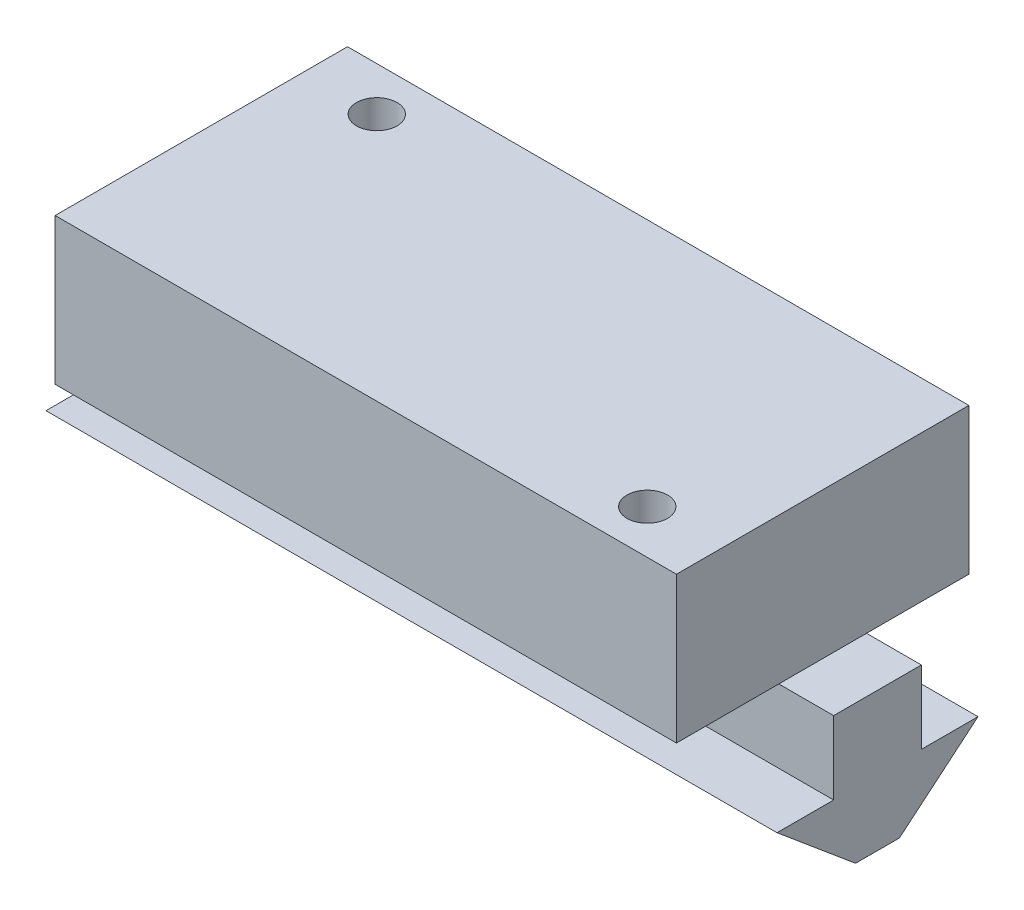
ISO-10303-21;
HEADER;
FILE_DESCRIPTION(('STEP AP214'),'2;1');
FILE_NAME('part.step','',(''),(''),'','','');
FILE_SCHEMA(('AUTOMOTIVE_DESIGN { 1 0 10303 214 1 1 1 1 }'));
ENDSEC;
DATA;
#1=APPLICATION_CONTEXT('core data for automotive mechanical design processes');
#2=APPLICATION_PROTOCOL_DEFINITION('international standard','automotive_design',2000,#1);
#3=PRODUCT_CONTEXT('',#1,'mechanical');
#4=PRODUCT('Part','Part','',(#3));
#5=PRODUCT_RELATED_PRODUCT_CATEGORY('part','',(#4));
#6=PRODUCT_DEFINITION_FORMATION('','',#4);
#7=PRODUCT_DEFINITION_CONTEXT('part definition',#1,'design');
#8=PRODUCT_DEFINITION('design','',#6,#7);
#9=PRODUCT_DEFINITION_SHAPE('','',#8);
#10=(LENGTH_UNIT() NAMED_UNIT(*) SI_UNIT(.MILLI.,.METRE.));
#11=(NAMED_UNIT(*) PLANE_ANGLE_UNIT() SI_UNIT($,.RADIAN.));
#12=(NAMED_UNIT(*) SI_UNIT($,.STERADIAN.) SOLID_ANGLE_UNIT());
#13=UNCERTAINTY_MEASURE_WITH_UNIT(LENGTH_MEASURE(1.E-05),#10,'distance_accuracy_value','');
#14=(GEOMETRIC_REPRESENTATION_CONTEXT(3) GLOBAL_UNCERTAINTY_ASSIGNED_CONTEXT((#13)) GLOBAL_UNIT_ASSIGNED_CONTEXT((#10,
#11,#12)) REPRESENTATION_CONTEXT('',''));
#15=CARTESIAN_POINT('',(0.,0.,0.));
#16=DIRECTION('',(0.,0.,1.));
#17=DIRECTION('',(1.,0.,0.));
#18=AXIS2_PLACEMENT_3D('',#15,#16,#17);
#19=CARTESIAN_POINT('',(0.,9.652,0.));
#20=DIRECTION('',(0.,1.,0.));
#21=DIRECTION('',(0.,0.,1.));
#22=AXIS2_PLACEMENT_3D('',#19,#20,#21);
#23=PLANE('',#22);
#24=DIRECTION('',(1.,0.,0.));
#25=VECTOR('',#24,1.);
#26=CARTESIAN_POINT('',(0.,9.652,-4.572));
#27=LINE('',#26,#25);
#28=CARTESIAN_POINT('',(46.99,9.652,-4.57200000000001));
#29=VERTEX_POINT('',#28);
#30=CARTESIAN_POINT('',(50.8,9.652,-4.57200000000001));
#31=VERTEX_POINT('',#30);
#32=EDGE_CURVE('E51',#29,#31,#27,.T.);
#33=ORIENTED_EDGE('',*,*,#32,.F.);
#34=DIRECTION('',(0.,0.,1.));
#35=VECTOR('',#34,1.);
#36=CARTESIAN_POINT('',(46.99,9.652,0.));
#37=LINE('',#36,#35);
#38=CARTESIAN_POINT('',(46.99,9.652,1.52399999999999));
#39=VERTEX_POINT('',#38);
#40=EDGE_CURVE('E11',#29,#39,#37,.T.);
#41=ORIENTED_EDGE('',*,*,#40,.T.);
#42=DIRECTION('',(1.,0.,0.));
#43=VECTOR('',#42,1.);
#44=CARTESIAN_POINT('',(0.,9.652,1.524));
#45=LINE('',#44,#43);
#46=CARTESIAN_POINT('',(50.8,9.652,1.52399999999999));
#47=VERTEX_POINT('',#46);
#48=EDGE_CURVE('E185',#39,#47,#45,.T.);
#49=ORIENTED_EDGE('',*,*,#48,.T.);
#50=DIRECTION('',(0.,0.,1.));
#51=VECTOR('',#50,1.);
#52=CARTESIAN_POINT('',(50.8,9.652,-4.57200000000001));
#53=LINE('',#52,#51);
#54=EDGE_CURVE('E189',#31,#47,#53,.T.);
#55=ORIENTED_EDGE('',*,*,#54,.F.);
#56=EDGE_LOOP('',(#33,#41,#49,#55));
#57=FACE_BOUND('',#56,.T.);
#58=ADVANCED_FACE('F33',(#57),#23,.T.);
#59=CARTESIAN_POINT('',(50.8,4.572,5.461));
#60=DIRECTION('',(0.,1.,0.));
#61=DIRECTION('',(0.,0.,1.));
#62=AXIS2_PLACEMENT_3D('',#59,#60,#61);
#63=PLANE('',#62);
#64=DIRECTION('',(0.,0.,-1.));
#65=VECTOR('',#64,1.);
#66=CARTESIAN_POINT('',(0.,4.572,5.461));
#67=LINE('',#66,#65);
#68=CARTESIAN_POINT('',(0.,4.572,-4.572));
#69=VERTEX_POINT('',#68);
#70=CARTESIAN_POINT('',(0.,4.572,-8.509));
#71=VERTEX_POINT('',#70);
#72=EDGE_CURVE('E233',#69,#71,#67,.T.);
#73=ORIENTED_EDGE('',*,*,#72,.F.);
#74=DIRECTION('',(1.,0.,0.));
#75=VECTOR('',#74,1.);
#76=CARTESIAN_POINT('',(0.,4.572,-4.572));
#77=LINE('',#76,#75);
#78=CARTESIAN_POINT('',(50.8,4.572,-4.572));
#79=VERTEX_POINT('',#78);
#80=EDGE_CURVE('E186',#69,#79,#77,.T.);
#81=ORIENTED_EDGE('',*,*,#80,.T.);
#82=DIRECTION('',(0.,0.,-1.));
#83=VECTOR('',#82,1.);
#84=CARTESIAN_POINT('',(50.8,4.572,5.461));
#85=LINE('',#84,#83);
#86=CARTESIAN_POINT('',(50.8,4.572,-8.509));
#87=VERTEX_POINT('',#86);
#88=EDGE_CURVE('E221',#79,#87,#85,.T.);
#89=ORIENTED_EDGE('',*,*,#88,.T.);
#90=DIRECTION('',(-1.,0.,0.));
#91=VECTOR('',#90,1.);
#92=CARTESIAN_POINT('',(50.8,4.572,-8.509));
#93=LINE('',#92,#91);
#94=EDGE_CURVE('E237',#87,#71,#93,.T.);
#95=ORIENTED_EDGE('',*,*,#94,.T.);
#96=EDGE_LOOP('',(#73,#81,#89,#95));
#97=FACE_BOUND('',#96,.T.);
#98=ADVANCED_FACE('F289',(#97),#63,.T.);
#99=CARTESIAN_POINT('',(50.8,4.572,5.461));
#100=DIRECTION('',(0.,0.766757672993104,-0.641936656459343));
#101=DIRECTION('',(0.,0.641936656459343,0.766757672993104));
#102=AXIS2_PLACEMENT_3D('',#99,#100,#101);
#103=PLANE('',#102);
#104=DIRECTION('',(0.,-0.641936656459343,-0.766757672993104));
#105=VECTOR('',#104,1.);
#106=CARTESIAN_POINT('',(0.,4.572,5.461));
#107=LINE('',#106,#105);
#108=CARTESIAN_POINT('',(0.,4.572,5.461));
#109=VERTEX_POINT('',#108);
#110=CARTESIAN_POINT('',(0.,0.,0.));
#111=VERTEX_POINT('',#110);
#112=EDGE_CURVE('E211',#109,#111,#107,.T.);
#113=ORIENTED_EDGE('',*,*,#112,.T.);
#114=DIRECTION('',(-1.,0.,0.));
#115=VECTOR('',#114,1.);
#116=CARTESIAN_POINT('',(50.8,0.,0.));
#117=LINE('',#116,#115);
#118=CARTESIAN_POINT('',(50.8,0.,0.));
#119=VERTEX_POINT('',#118);
#120=EDGE_CURVE('E37',#119,#111,#117,.T.);
#121=ORIENTED_EDGE('',*,*,#120,.F.);
#122=DIRECTION('',(0.,-0.641936656459343,-0.766757672993104));
#123=VECTOR('',#122,1.);
#124=CARTESIAN_POINT('',(50.8,4.572,5.461));
#125=LINE('',#124,#123);
#126=CARTESIAN_POINT('',(50.8,4.572,5.461));
#127=VERTEX_POINT('',#126);
#128=EDGE_CURVE('E212',#127,#119,#125,.T.);
#129=ORIENTED_EDGE('',*,*,#128,.F.);
#130=DIRECTION('',(-1.,0.,0.));
#131=VECTOR('',#130,1.);
#132=CARTESIAN_POINT('',(50.8,4.572,5.461));
#133=LINE('',#132,#131);
#134=EDGE_CURVE('E224',#127,#109,#133,.T.);
#135=ORIENTED_EDGE('',*,*,#134,.T.);
#136=EDGE_LOOP('',(#113,#121,#129,#135));
#137=FACE_BOUND('',#136,.T.);
#138=ADVANCED_FACE('F35',(#137),#103,.F.);
#139=CARTESIAN_POINT('',(50.8,0.,0.));
#140=DIRECTION('',(0.,1.,0.));
#141=DIRECTION('',(0.,0.,1.));
#142=AXIS2_PLACEMENT_3D('',#139,#140,#141);
#143=PLANE('',#142);
#144=DIRECTION('',(0.,0.,-1.));
#145=VECTOR('',#144,1.);
#146=CARTESIAN_POINT('',(0.,0.,0.));
#147=LINE('',#146,#145);
#148=CARTESIAN_POINT('',(0.,0.,-3.048));
#149=VERTEX_POINT('',#148);
#150=EDGE_CURVE('E227',#111,#149,#147,.T.);
#151=ORIENTED_EDGE('',*,*,#150,.T.);
#152=DIRECTION('',(-1.,0.,0.));
#153=VECTOR('',#152,1.);
#154=CARTESIAN_POINT('',(50.8,0.,-3.048));
#155=LINE('',#154,#153);
#156=CARTESIAN_POINT('',(50.8,0.,-3.048));
#157=VERTEX_POINT('',#156);
#158=EDGE_CURVE('E239',#157,#149,#155,.T.);
#159=ORIENTED_EDGE('',*,*,#158,.F.);
#160=DIRECTION('',(0.,0.,-1.));
#161=VECTOR('',#160,1.);
#162=CARTESIAN_POINT('',(50.8,0.,0.));
#163=LINE('',#162,#161);
#164=EDGE_CURVE('E215',#119,#157,#163,.T.);
#165=ORIENTED_EDGE('',*,*,#164,.F.);
#166=ORIENTED_EDGE('',*,*,#120,.T.);
#167=EDGE_LOOP('',(#151,#159,#165,#166));
#168=FACE_BOUND('',#167,.T.);
#169=ADVANCED_FACE('F327',(#168),#143,.F.);
#170=CARTESIAN_POINT('',(50.8,4.572,-8.509));
#171=DIRECTION('',(0.,-0.766757672993104,-0.641936656459343));
#172=DIRECTION('',(0.,0.641936656459343,-0.766757672993104));
#173=AXIS2_PLACEMENT_3D('',#170,#171,#172);
#174=PLANE('',#173);
#175=DIRECTION('',(0.,-0.641936656459343,0.766757672993104));
#176=VECTOR('',#175,1.);
#177=CARTESIAN_POINT('',(0.,4.572,-8.509));
#178=LINE('',#177,#176);
#179=EDGE_CURVE('E230',#71,#149,#178,.T.);
#180=ORIENTED_EDGE('',*,*,#179,.F.);
#181=ORIENTED_EDGE('',*,*,#94,.F.);
#182=DIRECTION('',(0.,-0.641936656459343,0.766757672993104));
#183=VECTOR('',#182,1.);
#184=CARTESIAN_POINT('',(50.8,4.572,-8.509));
#185=LINE('',#184,#183);
#186=EDGE_CURVE('E218',#87,#157,#185,.T.);
#187=ORIENTED_EDGE('',*,*,#186,.T.);
#188=ORIENTED_EDGE('',*,*,#158,.T.);
#189=EDGE_LOOP('',(#180,#181,#187,#188));
#190=FACE_BOUND('',#189,.T.);
#191=ADVANCED_FACE('F324',(#190),#174,.T.);
#192=DIRECTION('',(1.,0.,0.));
#193=VECTOR('',#192,1.);
#194=CARTESIAN_POINT('',(0.,4.572,1.524));
#195=LINE('',#194,#193);
#196=CARTESIAN_POINT('',(0.,4.572,1.524));
#197=VERTEX_POINT('',#196);
#198=CARTESIAN_POINT('',(50.8,4.572,1.52399999999999));
#199=VERTEX_POINT('',#198);
#200=EDGE_CURVE('E148',#197,#199,#195,.T.);
#201=ORIENTED_EDGE('',*,*,#200,.F.);
#202=EDGE_CURVE('E216',#109,#197,#67,.T.);
#203=ORIENTED_EDGE('',*,*,#202,.F.);
#204=ORIENTED_EDGE('',*,*,#134,.F.);
#205=EDGE_CURVE('E222',#127,#199,#85,.T.);
#206=ORIENTED_EDGE('',*,*,#205,.T.);
#207=EDGE_LOOP('',(#201,#203,#204,#206));
#208=FACE_BOUND('',#207,.T.);
#209=ADVANCED_FACE('F297',(#208),#63,.T.);
#210=CARTESIAN_POINT('',(50.8,0.,0.));
#211=DIRECTION('',(-1.,0.,0.));
#212=DIRECTION('',(0.,0.,1.));
#213=AXIS2_PLACEMENT_3D('',#210,#211,#212);
#214=PLANE('',#213);
#215=ORIENTED_EDGE('',*,*,#128,.T.);
#216=ORIENTED_EDGE('',*,*,#164,.T.);
#217=ORIENTED_EDGE('',*,*,#186,.F.);
#218=ORIENTED_EDGE('',*,*,#88,.F.);
#219=DIRECTION('',(0.,-1.,0.));
#220=VECTOR('',#219,1.);
#221=CARTESIAN_POINT('',(50.8,9.652,-4.57200000000001));
#222=LINE('',#221,#220);
#223=EDGE_CURVE('E202',#31,#79,#222,.T.);
#224=ORIENTED_EDGE('',*,*,#223,.F.);
#225=ORIENTED_EDGE('',*,*,#54,.T.);
#226=DIRECTION('',(0.,-1.,0.));
#227=VECTOR('',#226,1.);
#228=CARTESIAN_POINT('',(50.8,9.652,1.52399999999999));
#229=LINE('',#228,#227);
#230=EDGE_CURVE('E205',#47,#199,#229,.T.);
#231=ORIENTED_EDGE('',*,*,#230,.T.);
#232=ORIENTED_EDGE('',*,*,#205,.F.);
#233=EDGE_LOOP('',(#215,#216,#217,#218,#224,#225,#231,#232));
#234=FACE_BOUND('',#233,.T.);
#235=ADVANCED_FACE('F316',(#234),#214,.F.);
#236=CARTESIAN_POINT('',(0.,0.,0.));
#237=DIRECTION('',(-1.,0.,0.));
#238=DIRECTION('',(0.,0.,1.));
#239=AXIS2_PLACEMENT_3D('',#236,#237,#238);
#240=PLANE('',#239);
#241=ORIENTED_EDGE('',*,*,#112,.F.);
#242=ORIENTED_EDGE('',*,*,#202,.T.);
#243=DIRECTION('',(0.,-1.,0.));
#244=VECTOR('',#243,1.);
#245=CARTESIAN_POINT('',(0.,9.652,1.524));
#246=LINE('',#245,#244);
#247=CARTESIAN_POINT('',(0.,9.652,1.524));
#248=VERTEX_POINT('',#247);
#249=EDGE_CURVE('E208',#248,#197,#246,.T.);
#250=ORIENTED_EDGE('',*,*,#249,.F.);
#251=DIRECTION('',(0.,0.,1.));
#252=VECTOR('',#251,1.);
#253=CARTESIAN_POINT('',(0.,9.652,-4.572));
#254=LINE('',#253,#252);
#255=CARTESIAN_POINT('',(0.,9.652,-4.572));
#256=VERTEX_POINT('',#255);
#257=EDGE_CURVE('E182',#256,#248,#254,.T.);
#258=ORIENTED_EDGE('',*,*,#257,.F.);
#259=DIRECTION('',(0.,-1.,0.));
#260=VECTOR('',#259,1.);
#261=CARTESIAN_POINT('',(0.,9.652,-4.572));
#262=LINE('',#261,#260);
#263=EDGE_CURVE('E195',#256,#69,#262,.T.);
#264=ORIENTED_EDGE('',*,*,#263,.T.);
#265=ORIENTED_EDGE('',*,*,#72,.T.);
#266=ORIENTED_EDGE('',*,*,#179,.T.);
#267=ORIENTED_EDGE('',*,*,#150,.F.);
#268=EDGE_LOOP('',(#241,#242,#250,#258,#264,#265,#266,#267));
#269=FACE_BOUND('',#268,.T.);
#270=ADVANCED_FACE('F311',(#269),#240,.T.);
#271=CARTESIAN_POINT('',(0.,9.652,1.524));
#272=DIRECTION('',(0.,0.,-1.));
#273=DIRECTION('',(-1.,0.,0.));
#274=AXIS2_PLACEMENT_3D('',#271,#272,#273);
#275=PLANE('',#274);
#276=ORIENTED_EDGE('',*,*,#200,.T.);
#277=ORIENTED_EDGE('',*,*,#230,.F.);
#278=ORIENTED_EDGE('',*,*,#48,.F.);
#279=CARTESIAN_POINT('',(3.81,9.652,1.524));
#280=VERTEX_POINT('',#279);
#281=EDGE_CURVE('E190',#280,#39,#45,.T.);
#282=ORIENTED_EDGE('',*,*,#281,.F.);
#283=EDGE_CURVE('E187',#248,#280,#45,.T.);
#284=ORIENTED_EDGE('',*,*,#283,.F.);
#285=ORIENTED_EDGE('',*,*,#249,.T.);
#286=EDGE_LOOP('',(#276,#277,#278,#282,#284,#285));
#287=FACE_BOUND('',#286,.T.);
#288=ADVANCED_FACE('F306',(#287),#275,.F.);
#289=CARTESIAN_POINT('',(0.,9.652,-4.572));
#290=DIRECTION('',(0.,0.,-1.));
#291=DIRECTION('',(-1.,0.,0.));
#292=AXIS2_PLACEMENT_3D('',#289,#290,#291);
#293=PLANE('',#292);
#294=ORIENTED_EDGE('',*,*,#80,.F.);
#295=ORIENTED_EDGE('',*,*,#263,.F.);
#296=CARTESIAN_POINT('',(3.81,9.652,-4.572));
#297=VERTEX_POINT('',#296);
#298=EDGE_CURVE('E193',#256,#297,#27,.T.);
#299=ORIENTED_EDGE('',*,*,#298,.T.);
#300=EDGE_CURVE('E196',#297,#29,#27,.T.);
#301=ORIENTED_EDGE('',*,*,#300,.T.);
#302=ORIENTED_EDGE('',*,*,#32,.T.);
#303=ORIENTED_EDGE('',*,*,#223,.T.);
#304=EDGE_LOOP('',(#294,#295,#299,#301,#302,#303));
#305=FACE_BOUND('',#304,.T.);
#306=ADVANCED_FACE('F301',(#305),#293,.T.);
#307=DIRECTION('',(0.,0.,1.));
#308=VECTOR('',#307,1.);
#309=CARTESIAN_POINT('',(3.81,9.652,0.));
#310=LINE('',#309,#308);
#311=EDGE_CURVE('E42',#297,#280,#310,.T.);
#312=ORIENTED_EDGE('',*,*,#311,.F.);
#313=ORIENTED_EDGE('',*,*,#298,.F.);
#314=ORIENTED_EDGE('',*,*,#257,.T.);
#315=ORIENTED_EDGE('',*,*,#283,.T.);
#316=EDGE_LOOP('',(#312,#313,#314,#315));
#317=FACE_BOUND('',#316,.T.);
#318=ADVANCED_FACE('F291',(#317),#23,.T.);
#319=CARTESIAN_POINT('',(0.,9.652,0.));
#320=DIRECTION('',(0.,1.,0.));
#321=DIRECTION('',(0.,0.,1.));
#322=AXIS2_PLACEMENT_3D('',#319,#320,#321);
#323=PLANE('',#322);
#324=CARTESIAN_POINT('',(3.81,9.652,8.636));
#325=VERTEX_POINT('',#324);
#326=EDGE_CURVE('E171',#280,#325,#310,.T.);
#327=ORIENTED_EDGE('',*,*,#326,.F.);
#328=ORIENTED_EDGE('',*,*,#281,.T.);
#329=CARTESIAN_POINT('',(46.99,9.652,8.636));
#330=VERTEX_POINT('',#329);
#331=EDGE_CURVE('E45',#39,#330,#37,.T.);
#332=ORIENTED_EDGE('',*,*,#331,.T.);
#333=DIRECTION('',(1.,0.,0.));
#334=VECTOR('',#333,1.);
#335=CARTESIAN_POINT('',(0.,9.652,8.636));
#336=LINE('',#335,#334);
#337=EDGE_CURVE('E158',#325,#330,#336,.T.);
#338=ORIENTED_EDGE('',*,*,#337,.F.);
#339=EDGE_LOOP('',(#327,#328,#332,#338));
#340=FACE_BOUND('',#339,.T.);
#341=ADVANCED_FACE('F255',(#340),#323,.F.);
#342=CARTESIAN_POINT('',(46.99,19.812,0.));
#343=DIRECTION('',(1.,0.,0.));
#344=DIRECTION('',(0.,0.,-1.));
#345=AXIS2_PLACEMENT_3D('',#342,#343,#344);
#346=PLANE('',#345);
#347=CARTESIAN_POINT('',(46.99,9.652,-11.684));
#348=VERTEX_POINT('',#347);
#349=EDGE_CURVE('E44',#348,#29,#37,.T.);
#350=ORIENTED_EDGE('',*,*,#349,.F.);
#351=DIRECTION('',(0.,-1.,0.));
#352=VECTOR('',#351,1.);
#353=CARTESIAN_POINT('',(46.99,19.812,-11.684));
#354=LINE('',#353,#352);
#355=CARTESIAN_POINT('',(46.99,19.812,-11.684));
#356=VERTEX_POINT('',#355);
#357=EDGE_CURVE('E137',#356,#348,#354,.T.);
#358=ORIENTED_EDGE('',*,*,#357,.F.);
#359=DIRECTION('',(0.,0.,1.));
#360=VECTOR('',#359,1.);
#361=CARTESIAN_POINT('',(46.99,19.812,0.));
#362=LINE('',#361,#360);
#363=CARTESIAN_POINT('',(46.99,19.812,8.636));
#364=VERTEX_POINT('',#363);
#365=EDGE_CURVE('E141',#356,#364,#362,.T.);
#366=ORIENTED_EDGE('',*,*,#365,.T.);
#367=DIRECTION('',(0.,-1.,0.));
#368=VECTOR('',#367,1.);
#369=CARTESIAN_POINT('',(46.99,19.812,8.636));
#370=LINE('',#369,#368);
#371=EDGE_CURVE('E167',#364,#330,#370,.T.);
#372=ORIENTED_EDGE('',*,*,#371,.T.);
#373=ORIENTED_EDGE('',*,*,#331,.F.);
#374=ORIENTED_EDGE('',*,*,#40,.F.);
#375=EDGE_LOOP('',(#350,#358,#366,#372,#373,#374));
#376=FACE_BOUND('',#375,.T.);
#377=ADVANCED_FACE('F139',(#376),#346,.T.);
#378=CARTESIAN_POINT('',(0.,19.812,-11.684));
#379=DIRECTION('',(0.,0.,-1.));
#380=DIRECTION('',(-1.,0.,0.));
#381=AXIS2_PLACEMENT_3D('',#378,#379,#380);
#382=PLANE('',#381);
#383=DIRECTION('',(1.,0.,0.));
#384=VECTOR('',#383,1.);
#385=CARTESIAN_POINT('',(0.,9.652,-11.684));
#386=LINE('',#385,#384);
#387=CARTESIAN_POINT('',(3.81,9.652,-11.684));
#388=VERTEX_POINT('',#387);
#389=EDGE_CURVE('E169',#388,#348,#386,.T.);
#390=ORIENTED_EDGE('',*,*,#389,.F.);
#391=DIRECTION('',(0.,-1.,0.));
#392=VECTOR('',#391,1.);
#393=CARTESIAN_POINT('',(3.81,19.812,-11.684));
#394=LINE('',#393,#392);
#395=CARTESIAN_POINT('',(3.81,19.812,-11.684));
#396=VERTEX_POINT('',#395);
#397=EDGE_CURVE('E149',#396,#388,#394,.T.);
#398=ORIENTED_EDGE('',*,*,#397,.F.);
#399=DIRECTION('',(1.,0.,0.));
#400=VECTOR('',#399,1.);
#401=CARTESIAN_POINT('',(0.,19.812,-11.684));
#402=LINE('',#401,#400);
#403=EDGE_CURVE('E154',#396,#356,#402,.T.);
#404=ORIENTED_EDGE('',*,*,#403,.T.);
#405=ORIENTED_EDGE('',*,*,#357,.T.);
#406=EDGE_LOOP('',(#390,#398,#404,#405));
#407=FACE_BOUND('',#406,.T.);
#408=ADVANCED_FACE('F160',(#407),#382,.T.);
#409=CARTESIAN_POINT('',(3.81,19.812,0.));
#410=DIRECTION('',(1.,0.,0.));
#411=DIRECTION('',(0.,0.,-1.));
#412=AXIS2_PLACEMENT_3D('',#409,#410,#411);
#413=PLANE('',#412);
#414=EDGE_CURVE('E172',#388,#297,#310,.T.);
#415=ORIENTED_EDGE('',*,*,#414,.T.);
#416=ORIENTED_EDGE('',*,*,#311,.T.);
#417=ORIENTED_EDGE('',*,*,#326,.T.);
#418=DIRECTION('',(0.,-1.,0.));
#419=VECTOR('',#418,1.);
#420=CARTESIAN_POINT('',(3.81,19.812,8.636));
#421=LINE('',#420,#419);
#422=CARTESIAN_POINT('',(3.81,19.812,8.636));
#423=VERTEX_POINT('',#422);
#424=EDGE_CURVE('E178',#423,#325,#421,.T.);
#425=ORIENTED_EDGE('',*,*,#424,.F.);
#426=DIRECTION('',(0.,0.,1.));
#427=VECTOR('',#426,1.);
#428=CARTESIAN_POINT('',(3.81,19.812,0.));
#429=LINE('',#428,#427);
#430=EDGE_CURVE('E162',#396,#423,#429,.T.);
#431=ORIENTED_EDGE('',*,*,#430,.F.);
#432=ORIENTED_EDGE('',*,*,#397,.T.);
#433=EDGE_LOOP('',(#415,#416,#417,#425,#431,#432));
#434=FACE_BOUND('',#433,.T.);
#435=ADVANCED_FACE('F249',(#434),#413,.F.);
#436=CARTESIAN_POINT('',(0.,19.812,8.636));
#437=DIRECTION('',(0.,0.,-1.));
#438=DIRECTION('',(-1.,0.,0.));
#439=AXIS2_PLACEMENT_3D('',#436,#437,#438);
#440=PLANE('',#439);
#441=ORIENTED_EDGE('',*,*,#337,.T.);
#442=ORIENTED_EDGE('',*,*,#371,.F.);
#443=DIRECTION('',(1.,0.,0.));
#444=VECTOR('',#443,1.);
#445=CARTESIAN_POINT('',(0.,19.812,8.636));
#446=LINE('',#445,#444);
#447=EDGE_CURVE('E156',#423,#364,#446,.T.);
#448=ORIENTED_EDGE('',*,*,#447,.F.);
#449=ORIENTED_EDGE('',*,*,#424,.T.);
#450=EDGE_LOOP('',(#441,#442,#448,#449));
#451=FACE_BOUND('',#450,.T.);
#452=ADVANCED_FACE('F254',(#451),#440,.F.);
#453=CARTESIAN_POINT('',(0.,19.812,0.));
#454=DIRECTION('',(0.,1.,0.));
#455=DIRECTION('',(0.,0.,1.));
#456=AXIS2_PLACEMENT_3D('',#453,#454,#455);
#457=PLANE('',#456);
#458=CARTESIAN_POINT('',(41.91,19.812,5.588));
#459=DIRECTION('',(0.,1.,0.));
#460=DIRECTION('',(0.,0.,1.));
#461=AXIS2_PLACEMENT_3D('',#458,#459,#460);
#462=CIRCLE('',#461,1.4097);
#463=CARTESIAN_POINT('',(41.91,19.812,6.9977));
#464=VERTEX_POINT('',#463);
#465=EDGE_CURVE('E260',#464,#464,#462,.T.);
#466=ORIENTED_EDGE('',*,*,#465,.F.);
#467=EDGE_LOOP('',(#466));
#468=FACE_BOUND('',#467,.T.);
#469=CARTESIAN_POINT('',(8.89,19.812,-8.636));
#470=DIRECTION('',(0.,1.,0.));
#471=DIRECTION('',(0.,0.,1.));
#472=AXIS2_PLACEMENT_3D('',#469,#470,#471);
#473=CIRCLE('',#472,1.4097);
#474=CARTESIAN_POINT('',(8.89,19.812,-7.2263));
#475=VERTEX_POINT('',#474);
#476=EDGE_CURVE('E269',#475,#475,#473,.T.);
#477=ORIENTED_EDGE('',*,*,#476,.F.);
#478=EDGE_LOOP('',(#477));
#479=FACE_BOUND('',#478,.T.);
#480=ORIENTED_EDGE('',*,*,#365,.F.);
#481=ORIENTED_EDGE('',*,*,#403,.F.);
#482=ORIENTED_EDGE('',*,*,#430,.T.);
#483=ORIENTED_EDGE('',*,*,#447,.T.);
#484=EDGE_LOOP('',(#480,#481,#482,#483));
#485=FACE_BOUND('',#484,.T.);
#486=ADVANCED_FACE('F153',(#468,#479,#485),#457,.T.);
#487=ORIENTED_EDGE('',*,*,#300,.F.);
#488=ORIENTED_EDGE('',*,*,#414,.F.);
#489=ORIENTED_EDGE('',*,*,#389,.T.);
#490=ORIENTED_EDGE('',*,*,#349,.T.);
#491=EDGE_LOOP('',(#487,#488,#489,#490));
#492=FACE_BOUND('',#491,.T.);
#493=ADVANCED_FACE('F276',(#492),#323,.F.);
#494=CARTESIAN_POINT('',(8.89,12.192,-8.636));
#495=DIRECTION('',(0.,1.,0.));
#496=DIRECTION('',(0.,0.,1.));
#497=AXIS2_PLACEMENT_3D('',#494,#495,#496);
#498=CYLINDRICAL_SURFACE('',#497,1.4097);
#499=CARTESIAN_POINT('',(8.89,12.192,-8.636));
#500=DIRECTION('',(0.,1.,0.));
#501=DIRECTION('',(0.,0.,1.));
#502=AXIS2_PLACEMENT_3D('',#499,#500,#501);
#503=CIRCLE('',#502,1.4097);
#504=CARTESIAN_POINT('',(8.89,12.192,-7.2263));
#505=VERTEX_POINT('',#504);
#506=EDGE_CURVE('E265',#505,#505,#503,.T.);
#507=CARTESIAN_POINT('',(8.89,12.192,-7.2263));
#508=CARTESIAN_POINT('',(8.89,12.271375,-7.2263));
#509=CARTESIAN_POINT('',(8.89,12.35075,-7.2263));
#510=CARTESIAN_POINT('',(8.89,12.5095,-7.2263));
#511=CARTESIAN_POINT('',(8.89,12.588875,-7.2263));
#512=CARTESIAN_POINT('',(8.89,12.747625,-7.2263));
#513=CARTESIAN_POINT('',(8.89,12.827,-7.2263));
#514=CARTESIAN_POINT('',(8.89,12.98575,-7.2263));
#515=CARTESIAN_POINT('',(8.89,13.065125,-7.2263));
#516=CARTESIAN_POINT('',(8.89,13.223875,-7.2263));
#517=CARTESIAN_POINT('',(8.89,13.30325,-7.2263));
#518=CARTESIAN_POINT('',(8.89,13.462,-7.2263));
#519=CARTESIAN_POINT('',(8.89,13.541375,-7.2263));
#520=CARTESIAN_POINT('',(8.89,13.700125,-7.2263));
#521=CARTESIAN_POINT('',(8.89,13.7795,-7.2263));
#522=CARTESIAN_POINT('',(8.89,13.93825,-7.2263));
#523=CARTESIAN_POINT('',(8.89,14.017625,-7.2263));
#524=CARTESIAN_POINT('',(8.89,14.176375,-7.2263));
#525=CARTESIAN_POINT('',(8.89,14.25575,-7.2263));
#526=CARTESIAN_POINT('',(8.89,14.4145,-7.2263));
#527=CARTESIAN_POINT('',(8.89,14.493875,-7.2263));
#528=CARTESIAN_POINT('',(8.89,14.652625,-7.2263));
#529=CARTESIAN_POINT('',(8.89,14.732,-7.2263));
#530=CARTESIAN_POINT('',(8.89,14.89075,-7.2263));
#531=CARTESIAN_POINT('',(8.89,14.970125,-7.2263));
#532=CARTESIAN_POINT('',(8.89,15.128875,-7.2263));
#533=CARTESIAN_POINT('',(8.89,15.20825,-7.2263));
#534=CARTESIAN_POINT('',(8.89,15.367,-7.2263));
#535=CARTESIAN_POINT('',(8.89,15.446375,-7.2263));
#536=CARTESIAN_POINT('',(8.89,15.605125,-7.2263));
#537=CARTESIAN_POINT('',(8.89,15.6845,-7.2263));
#538=CARTESIAN_POINT('',(8.89,15.84325,-7.2263));
#539=CARTESIAN_POINT('',(8.89,15.922625,-7.2263));
#540=CARTESIAN_POINT('',(8.89,16.081375,-7.2263));
#541=CARTESIAN_POINT('',(8.89,16.16075,-7.2263));
#542=CARTESIAN_POINT('',(8.89,16.3195,-7.2263));
#543=CARTESIAN_POINT('',(8.89,16.398875,-7.2263));
#544=CARTESIAN_POINT('',(8.89,16.557625,-7.2263));
#545=CARTESIAN_POINT('',(8.89,16.637,-7.2263));
#546=CARTESIAN_POINT('',(8.89,16.79575,-7.2263));
#547=CARTESIAN_POINT('',(8.89,16.875125,-7.2263));
#548=CARTESIAN_POINT('',(8.89,17.033875,-7.2263));
#549=CARTESIAN_POINT('',(8.89,17.11325,-7.2263));
#550=CARTESIAN_POINT('',(8.89,17.272,-7.2263));
#551=CARTESIAN_POINT('',(8.89,17.351375,-7.2263));
#552=CARTESIAN_POINT('',(8.89,17.510125,-7.2263));
#553=CARTESIAN_POINT('',(8.89,17.5895,-7.2263));
#554=CARTESIAN_POINT('',(8.89,17.74825,-7.2263));
#555=CARTESIAN_POINT('',(8.89,17.827625,-7.2263));
#556=CARTESIAN_POINT('',(8.89,17.986375,-7.2263));
#557=CARTESIAN_POINT('',(8.89,18.06575,-7.2263));
#558=CARTESIAN_POINT('',(8.89,18.2245,-7.2263));
#559=CARTESIAN_POINT('',(8.89,18.303875,-7.2263));
#560=CARTESIAN_POINT('',(8.89,18.462625,-7.2263));
#561=CARTESIAN_POINT('',(8.89,18.542,-7.2263));
#562=CARTESIAN_POINT('',(8.89,18.70075,-7.2263));
#563=CARTESIAN_POINT('',(8.89,18.780125,-7.2263));
#564=CARTESIAN_POINT('',(8.89,18.938875,-7.2263));
#565=CARTESIAN_POINT('',(8.89,19.01825,-7.2263));
#566=CARTESIAN_POINT('',(8.89,19.177,-7.2263));
#567=CARTESIAN_POINT('',(8.89,19.256375,-7.2263));
#568=CARTESIAN_POINT('',(8.89,19.415125,-7.2263));
#569=CARTESIAN_POINT('',(8.89,19.4945,-7.2263));
#570=CARTESIAN_POINT('',(8.89,19.65325,-7.2263));
#571=CARTESIAN_POINT('',(8.89,19.732625,-7.2263));
#572=CARTESIAN_POINT('',(8.89,19.812,-7.2263));
#573=B_SPLINE_CURVE_WITH_KNOTS('',3,(#507,#508,#509,#510,#511,#512,#513,#514,#515,#516,#517,
#518,#519,#520,#521,#522,#523,#524,#525,#526,#527,#528,#529,#530,#531,#532,#533,#534,#535,#536,
#537,#538,#539,#540,#541,#542,#543,#544,#545,#546,#547,#548,#549,#550,#551,#552,#553,#554,#555,
#556,#557,#558,#559,#560,#561,#562,#563,#564,#565,#566,#567,#568,#569,#570,#571,#572),
.UNSPECIFIED.,.F.,.F.,(4,2,2,2,2,2,2,2,2,2,2,2,2,2,2,2,2,2,2,2,2,2,2,2,2,2,2,2,2,2,2,2,4),(0.,
0.238124999999999,0.476249999999999,0.714374999999998,0.952499999999998,1.190625,1.42875,
1.666875,1.905,2.143125,2.38125,2.619375,2.8575,3.095625,3.33375,3.571875,3.81,4.048125,
4.28624999999999,4.524375,4.7625,5.000625,5.23875,5.476875,5.71499999999999,5.953125,6.19125,
6.429375,6.6675,6.905625,7.14374999999999,7.381875,7.61999999999999),.UNSPECIFIED.);
#574=EDGE_CURVE('BSEAM273',#505,#475,#573,.T.);
#575=ORIENTED_EDGE('',*,*,#506,.F.);
#576=ORIENTED_EDGE('',*,*,#476,.T.);
#577=ORIENTED_EDGE('',*,*,#574,.T.);
#578=ORIENTED_EDGE('',*,*,#574,.F.);
#579=EDGE_LOOP('',(#575,#577,#576,#578));
#580=FACE_BOUND('',#579,.T.);
#581=ADVANCED_FACE('F273',(#580),#498,.F.);
#582=CARTESIAN_POINT('',(8.89,12.192,-8.636));
#583=DIRECTION('',(0.,1.,0.));
#584=DIRECTION('',(0.,0.,1.));
#585=AXIS2_PLACEMENT_3D('',#582,#583,#584);
#586=PLANE('',#585);
#587=ORIENTED_EDGE('',*,*,#506,.T.);
#588=EDGE_LOOP('',(#587));
#589=FACE_BOUND('',#588,.T.);
#590=ADVANCED_FACE('F454',(#589),#586,.T.);
#591=CARTESIAN_POINT('',(41.91,12.192,5.588));
#592=DIRECTION('',(0.,1.,0.));
#593=DIRECTION('',(0.,0.,1.));
#594=AXIS2_PLACEMENT_3D('',#591,#592,#593);
#595=CYLINDRICAL_SURFACE('',#594,1.4097);
#596=CARTESIAN_POINT('',(41.91,12.192,5.588));
#597=DIRECTION('',(0.,1.,0.));
#598=DIRECTION('',(0.,0.,1.));
#599=AXIS2_PLACEMENT_3D('',#596,#597,#598);
#600=CIRCLE('',#599,1.4097);
#601=CARTESIAN_POINT('',(41.91,12.192,6.9977));
#602=VERTEX_POINT('',#601);
#603=EDGE_CURVE('E258',#602,#602,#600,.T.);
#604=CARTESIAN_POINT('',(41.91,12.192,6.9977));
#605=CARTESIAN_POINT('',(41.91,12.271375,6.9977));
#606=CARTESIAN_POINT('',(41.91,12.35075,6.9977));
#607=CARTESIAN_POINT('',(41.91,12.5095,6.9977));
#608=CARTESIAN_POINT('',(41.91,12.588875,6.9977));
#609=CARTESIAN_POINT('',(41.91,12.747625,6.9977));
#610=CARTESIAN_POINT('',(41.91,12.827,6.9977));
#611=CARTESIAN_POINT('',(41.91,12.98575,6.9977));
#612=CARTESIAN_POINT('',(41.91,13.065125,6.9977));
#613=CARTESIAN_POINT('',(41.91,13.223875,6.9977));
#614=CARTESIAN_POINT('',(41.91,13.30325,6.9977));
#615=CARTESIAN_POINT('',(41.91,13.462,6.9977));
#616=CARTESIAN_POINT('',(41.91,13.541375,6.9977));
#617=CARTESIAN_POINT('',(41.91,13.700125,6.9977));
#618=CARTESIAN_POINT('',(41.91,13.7795,6.9977));
#619=CARTESIAN_POINT('',(41.91,13.93825,6.9977));
#620=CARTESIAN_POINT('',(41.91,14.017625,6.9977));
#621=CARTESIAN_POINT('',(41.91,14.176375,6.9977));
#622=CARTESIAN_POINT('',(41.91,14.25575,6.9977));
#623=CARTESIAN_POINT('',(41.91,14.4145,6.9977));
#624=CARTESIAN_POINT('',(41.91,14.493875,6.9977));
#625=CARTESIAN_POINT('',(41.91,14.652625,6.9977));
#626=CARTESIAN_POINT('',(41.91,14.732,6.9977));
#627=CARTESIAN_POINT('',(41.91,14.89075,6.9977));
#628=CARTESIAN_POINT('',(41.91,14.970125,6.9977));
#629=CARTESIAN_POINT('',(41.91,15.128875,6.9977));
#630=CARTESIAN_POINT('',(41.91,15.20825,6.9977));
#631=CARTESIAN_POINT('',(41.91,15.367,6.9977));
#632=CARTESIAN_POINT('',(41.91,15.446375,6.9977));
#633=CARTESIAN_POINT('',(41.91,15.605125,6.9977));
#634=CARTESIAN_POINT('',(41.91,15.6845,6.9977));
#635=CARTESIAN_POINT('',(41.91,15.84325,6.9977));
#636=CARTESIAN_POINT('',(41.91,15.922625,6.9977));
#637=CARTESIAN_POINT('',(41.91,16.081375,6.9977));
#638=CARTESIAN_POINT('',(41.91,16.16075,6.9977));
#639=CARTESIAN_POINT('',(41.91,16.3195,6.9977));
#640=CARTESIAN_POINT('',(41.91,16.398875,6.9977));
#641=CARTESIAN_POINT('',(41.91,16.557625,6.9977));
#642=CARTESIAN_POINT('',(41.91,16.637,6.9977));
#643=CARTESIAN_POINT('',(41.91,16.79575,6.9977));
#644=CARTESIAN_POINT('',(41.91,16.875125,6.9977));
#645=CARTESIAN_POINT('',(41.91,17.033875,6.9977));
#646=CARTESIAN_POINT('',(41.91,17.11325,6.9977));
#647=CARTESIAN_POINT('',(41.91,17.272,6.9977));
#648=CARTESIAN_POINT('',(41.91,17.351375,6.9977));
#649=CARTESIAN_POINT('',(41.91,17.510125,6.9977));
#650=CARTESIAN_POINT('',(41.91,17.5895,6.9977));
#651=CARTESIAN_POINT('',(41.91,17.74825,6.9977));
#652=CARTESIAN_POINT('',(41.91,17.827625,6.9977));
#653=CARTESIAN_POINT('',(41.91,17.986375,6.9977));
#654=CARTESIAN_POINT('',(41.91,18.06575,6.9977));
#655=CARTESIAN_POINT('',(41.91,18.2245,6.9977));
#656=CARTESIAN_POINT('',(41.91,18.303875,6.9977));
#657=CARTESIAN_POINT('',(41.91,18.462625,6.9977));
#658=CARTESIAN_POINT('',(41.91,18.542,6.9977));
#659=CARTESIAN_POINT('',(41.91,18.70075,6.9977));
#660=CARTESIAN_POINT('',(41.91,18.780125,6.9977));
#661=CARTESIAN_POINT('',(41.91,18.938875,6.9977));
#662=CARTESIAN_POINT('',(41.91,19.01825,6.9977));
#663=CARTESIAN_POINT('',(41.91,19.177,6.9977));
#664=CARTESIAN_POINT('',(41.91,19.256375,6.9977));
#665=CARTESIAN_POINT('',(41.91,19.415125,6.9977));
#666=CARTESIAN_POINT('',(41.91,19.4945,6.9977));
#667=CARTESIAN_POINT('',(41.91,19.65325,6.9977));
#668=CARTESIAN_POINT('',(41.91,19.732625,6.9977));
#669=CARTESIAN_POINT('',(41.91,19.812,6.9977));
#670=B_SPLINE_CURVE_WITH_KNOTS('',3,(#604,#605,#606,#607,#608,#609,#610,#611,#612,#613,#614,
#615,#616,#617,#618,#619,#620,#621,#622,#623,#624,#625,#626,#627,#628,#629,#630,#631,#632,#633,
#634,#635,#636,#637,#638,#639,#640,#641,#642,#643,#644,#645,#646,#647,#648,#649,#650,#651,#652,
#653,#654,#655,#656,#657,#658,#659,#660,#661,#662,#663,#664,#665,#666,#667,#668,#669),
.UNSPECIFIED.,.F.,.F.,(4,2,2,2,2,2,2,2,2,2,2,2,2,2,2,2,2,2,2,2,2,2,2,2,2,2,2,2,2,2,2,2,4),(0.,
0.238124999999999,0.476249999999999,0.714374999999998,0.952499999999998,1.190625,1.42875,
1.666875,1.905,2.143125,2.38125,2.619375,2.8575,3.095625,3.33375,3.571875,3.81,4.048125,
4.28624999999999,4.524375,4.7625,5.000625,5.23875,5.476875,5.71499999999999,5.953125,6.19125,
6.429375,6.6675,6.905625,7.14374999999999,7.381875,7.61999999999999),.UNSPECIFIED.);
#671=EDGE_CURVE('BSEAM463',#602,#464,#670,.T.);
#672=ORIENTED_EDGE('',*,*,#603,.F.);
#673=ORIENTED_EDGE('',*,*,#465,.T.);
#674=ORIENTED_EDGE('',*,*,#671,.T.);
#675=ORIENTED_EDGE('',*,*,#671,.F.);
#676=EDGE_LOOP('',(#672,#674,#673,#675));
#677=FACE_BOUND('',#676,.T.);
#678=ADVANCED_FACE('F463',(#677),#595,.F.);
#679=CARTESIAN_POINT('',(41.91,12.192,5.588));
#680=DIRECTION('',(0.,1.,0.));
#681=DIRECTION('',(0.,0.,1.));
#682=AXIS2_PLACEMENT_3D('',#679,#680,#681);
#683=PLANE('',#682);
#684=ORIENTED_EDGE('',*,*,#603,.T.);
#685=EDGE_LOOP('',(#684));
#686=FACE_BOUND('',#685,.T.);
#687=ADVANCED_FACE('F473',(#686),#683,.T.);
#688=CLOSED_SHELL('',(#58,#98,#138,#169,#191,#209,#235,#270,#288,#306,#318,#341,#377,#408,#435,
#452,#486,#493,#581,#590,#678,#687));
#689=MANIFOLD_SOLID_BREP('B2',#688);
#690=ADVANCED_BREP_SHAPE_REPRESENTATION('',(#18,#689),#14);
#691=SHAPE_DEFINITION_REPRESENTATION(#9,#690);
ENDSEC;
END-ISO-10303-21;
